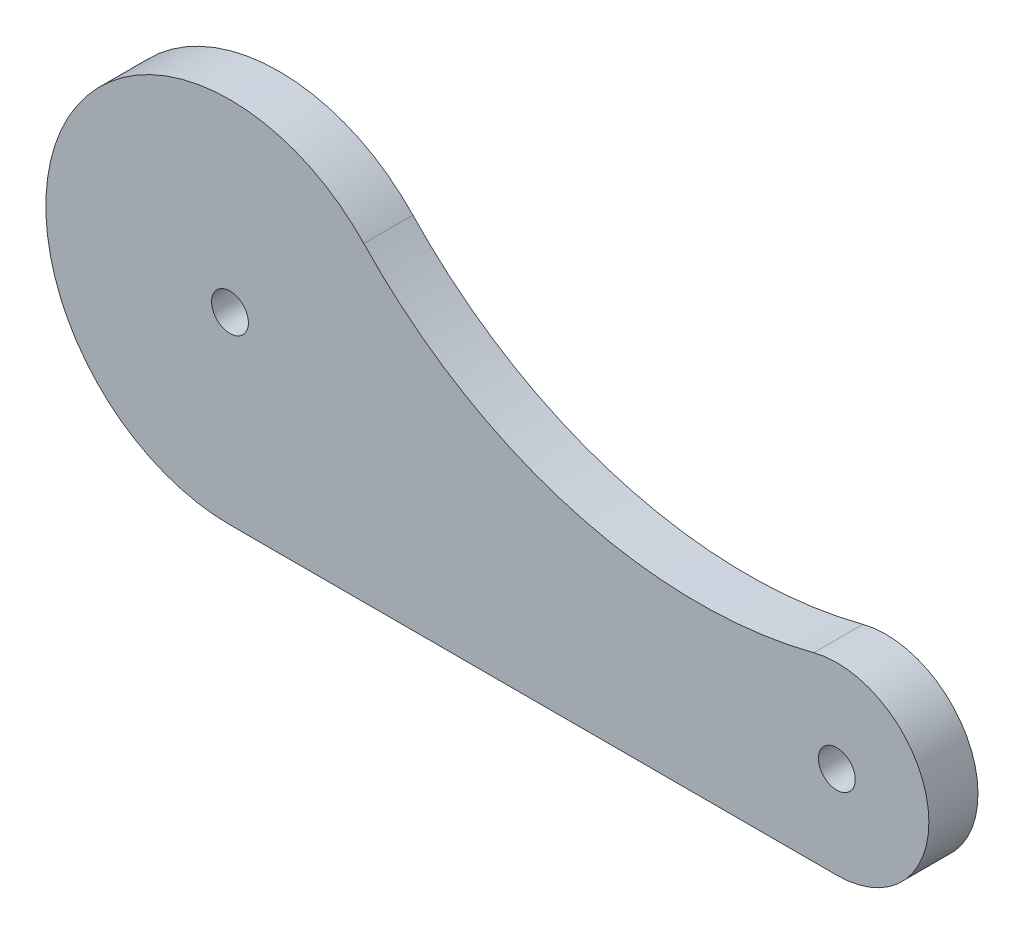
ISO-10303-21;
HEADER;
FILE_DESCRIPTION(('STEP AP214'),'2;1');
FILE_NAME('part.step','',(''),(''),'','','');
FILE_SCHEMA(('AUTOMOTIVE_DESIGN { 1 0 10303 214 1 1 1 1 }'));
ENDSEC;
DATA;
#1=APPLICATION_CONTEXT('core data for automotive mechanical design processes');
#2=APPLICATION_PROTOCOL_DEFINITION('international standard','automotive_design',2000,#1);
#3=PRODUCT_CONTEXT('',#1,'mechanical');
#4=PRODUCT('Part','Part','',(#3));
#5=PRODUCT_RELATED_PRODUCT_CATEGORY('part','',(#4));
#6=PRODUCT_DEFINITION_FORMATION('','',#4);
#7=PRODUCT_DEFINITION_CONTEXT('part definition',#1,'design');
#8=PRODUCT_DEFINITION('design','',#6,#7);
#9=PRODUCT_DEFINITION_SHAPE('','',#8);
#10=(LENGTH_UNIT() NAMED_UNIT(*) SI_UNIT(.MILLI.,.METRE.));
#11=(NAMED_UNIT(*) PLANE_ANGLE_UNIT() SI_UNIT($,.RADIAN.));
#12=(NAMED_UNIT(*) SI_UNIT($,.STERADIAN.) SOLID_ANGLE_UNIT());
#13=UNCERTAINTY_MEASURE_WITH_UNIT(LENGTH_MEASURE(1.E-05),#10,'distance_accuracy_value','');
#14=(GEOMETRIC_REPRESENTATION_CONTEXT(3) GLOBAL_UNCERTAINTY_ASSIGNED_CONTEXT((#13)) GLOBAL_UNIT_ASSIGNED_CONTEXT((#10,
#11,#12)) REPRESENTATION_CONTEXT('',''));
#15=CARTESIAN_POINT('',(0.,0.,0.));
#16=DIRECTION('',(0.,0.,1.));
#17=DIRECTION('',(1.,0.,0.));
#18=AXIS2_PLACEMENT_3D('',#15,#16,#17);
#19=CARTESIAN_POINT('',(0.,0.,4.));
#20=DIRECTION('',(0.,0.,1.));
#21=DIRECTION('',(1.,0.,0.));
#22=AXIS2_PLACEMENT_3D('',#19,#20,#21);
#23=PLANE('',#22);
#24=CARTESIAN_POINT('',(0.,0.,4.));
#25=DIRECTION('',(0.,0.,1.));
#26=DIRECTION('',(1.,0.,0.));
#27=AXIS2_PLACEMENT_3D('',#24,#25,#26);
#28=CIRCLE('',#27,1.5);
#29=CARTESIAN_POINT('',(1.5,0.,4.));
#30=VERTEX_POINT('',#29);
#31=EDGE_CURVE('E99',#30,#30,#28,.T.);
#32=ORIENTED_EDGE('',*,*,#31,.F.);
#33=EDGE_LOOP('',(#32));
#34=FACE_BOUND('',#33,.T.);
#35=CARTESIAN_POINT('',(0.,0.,4.));
#36=DIRECTION('',(0.,0.,1.));
#37=DIRECTION('',(1.,0.,0.));
#38=AXIS2_PLACEMENT_3D('',#35,#36,#37);
#39=CIRCLE('',#38,15.);
#40=CARTESIAN_POINT('',(10.9010401896387,10.3037528495147,4.));
#41=VERTEX_POINT('',#40);
#42=CARTESIAN_POINT('',(0.,-15.,4.));
#43=VERTEX_POINT('',#42);
#44=EDGE_CURVE('E84',#41,#43,#39,.T.);
#45=ORIENTED_EDGE('',*,*,#44,.T.);
#46=DIRECTION('',(1.,0.,0.));
#47=VECTOR('',#46,1.);
#48=CARTESIAN_POINT('',(0.,-15.,4.));
#49=LINE('',#48,#47);
#50=CARTESIAN_POINT('',(49.434299833213,-15.,4.));
#51=VERTEX_POINT('',#50);
#52=EDGE_CURVE('E79',#43,#51,#49,.T.);
#53=ORIENTED_EDGE('',*,*,#52,.T.);
#54=CARTESIAN_POINT('',(49.434299833213,-7.5,4.));
#55=DIRECTION('',(0.,0.,1.));
#56=DIRECTION('',(1.,0.,0.));
#57=AXIS2_PLACEMENT_3D('',#54,#55,#56);
#58=CIRCLE('',#57,7.50000000000001);
#59=CARTESIAN_POINT('',(47.5541899716334,-0.239477504449751,4.));
#60=VERTEX_POINT('',#59);
#61=EDGE_CURVE('E82',#51,#60,#58,.T.);
#62=ORIENTED_EDGE('',*,*,#61,.T.);
#63=CARTESIAN_POINT('',(38.1536406637354,36.0631349733015,4.));
#64=DIRECTION('',(0.,0.,-1.));
#65=DIRECTION('',(1.,0.,0.));
#66=AXIS2_PLACEMENT_3D('',#63,#64,#65);
#67=CIRCLE('',#66,37.5);
#68=EDGE_CURVE('E49',#60,#41,#67,.T.);
#69=ORIENTED_EDGE('',*,*,#68,.T.);
#70=EDGE_LOOP('',(#45,#53,#62,#69));
#71=FACE_BOUND('',#70,.T.);
#72=CARTESIAN_POINT('',(49.434299833213,-7.5,4.));
#73=DIRECTION('',(0.,0.,1.));
#74=DIRECTION('',(1.,0.,0.));
#75=AXIS2_PLACEMENT_3D('',#72,#73,#74);
#76=CIRCLE('',#75,1.5);
#77=CARTESIAN_POINT('',(50.934299833213,-7.5,4.));
#78=VERTEX_POINT('',#77);
#79=EDGE_CURVE('E114',#78,#78,#76,.T.);
#80=ORIENTED_EDGE('',*,*,#79,.F.);
#81=EDGE_LOOP('',(#80));
#82=FACE_BOUND('',#81,.T.);
#83=ADVANCED_FACE('F32',(#34,#71,#82),#23,.T.);
#84=CARTESIAN_POINT('',(0.,0.,0.));
#85=DIRECTION('',(0.,0.,1.));
#86=DIRECTION('',(1.,0.,0.));
#87=AXIS2_PLACEMENT_3D('',#84,#85,#86);
#88=PLANE('',#87);
#89=CARTESIAN_POINT('',(0.,0.,0.));
#90=DIRECTION('',(0.,0.,1.));
#91=DIRECTION('',(1.,0.,0.));
#92=AXIS2_PLACEMENT_3D('',#89,#90,#91);
#93=CIRCLE('',#92,1.5);
#94=CARTESIAN_POINT('',(1.5,0.,0.));
#95=VERTEX_POINT('',#94);
#96=EDGE_CURVE('E111',#95,#95,#93,.T.);
#97=ORIENTED_EDGE('',*,*,#96,.T.);
#98=EDGE_LOOP('',(#97));
#99=FACE_BOUND('',#98,.T.);
#100=CARTESIAN_POINT('',(0.,0.,0.));
#101=DIRECTION('',(0.,0.,1.));
#102=DIRECTION('',(1.,0.,0.));
#103=AXIS2_PLACEMENT_3D('',#100,#101,#102);
#104=CIRCLE('',#103,15.);
#105=CARTESIAN_POINT('',(10.9010401896387,10.3037528495147,0.));
#106=VERTEX_POINT('',#105);
#107=CARTESIAN_POINT('',(0.,-15.,0.));
#108=VERTEX_POINT('',#107);
#109=EDGE_CURVE('E96',#106,#108,#104,.T.);
#110=ORIENTED_EDGE('',*,*,#109,.F.);
#111=CARTESIAN_POINT('',(38.1536406637354,36.0631349733015,0.));
#112=DIRECTION('',(0.,0.,-1.));
#113=DIRECTION('',(1.,0.,0.));
#114=AXIS2_PLACEMENT_3D('',#111,#112,#113);
#115=CIRCLE('',#114,37.5);
#116=CARTESIAN_POINT('',(47.5541899716334,-0.239477504449751,0.));
#117=VERTEX_POINT('',#116);
#118=EDGE_CURVE('E72',#117,#106,#115,.T.);
#119=ORIENTED_EDGE('',*,*,#118,.F.);
#120=CARTESIAN_POINT('',(49.434299833213,-7.5,0.));
#121=DIRECTION('',(0.,0.,1.));
#122=DIRECTION('',(1.,0.,0.));
#123=AXIS2_PLACEMENT_3D('',#120,#121,#122);
#124=CIRCLE('',#123,7.50000000000001);
#125=CARTESIAN_POINT('',(49.434299833213,-15.,0.));
#126=VERTEX_POINT('',#125);
#127=EDGE_CURVE('E66',#126,#117,#124,.T.);
#128=ORIENTED_EDGE('',*,*,#127,.F.);
#129=DIRECTION('',(1.,0.,0.));
#130=VECTOR('',#129,1.);
#131=CARTESIAN_POINT('',(0.,-15.,0.));
#132=LINE('',#131,#130);
#133=EDGE_CURVE('E88',#108,#126,#132,.T.);
#134=ORIENTED_EDGE('',*,*,#133,.F.);
#135=EDGE_LOOP('',(#110,#119,#128,#134));
#136=FACE_BOUND('',#135,.T.);
#137=CARTESIAN_POINT('',(49.434299833213,-7.5,0.));
#138=DIRECTION('',(0.,0.,1.));
#139=DIRECTION('',(1.,0.,0.));
#140=AXIS2_PLACEMENT_3D('',#137,#138,#139);
#141=CIRCLE('',#140,1.5);
#142=CARTESIAN_POINT('',(50.934299833213,-7.5,0.));
#143=VERTEX_POINT('',#142);
#144=EDGE_CURVE('E117',#143,#143,#141,.T.);
#145=ORIENTED_EDGE('',*,*,#144,.T.);
#146=EDGE_LOOP('',(#145));
#147=FACE_BOUND('',#146,.T.);
#148=ADVANCED_FACE('F107',(#99,#136,#147),#88,.F.);
#149=CARTESIAN_POINT('',(0.,0.,4.));
#150=DIRECTION('',(0.,0.,-1.));
#151=DIRECTION('',(-1.,0.,0.));
#152=AXIS2_PLACEMENT_3D('',#149,#150,#151);
#153=CYLINDRICAL_SURFACE('',#152,15.);
#154=ORIENTED_EDGE('',*,*,#109,.T.);
#155=DIRECTION('',(0.,0.,-1.));
#156=VECTOR('',#155,1.);
#157=CARTESIAN_POINT('',(0.,-15.,4.));
#158=LINE('',#157,#156);
#159=EDGE_CURVE('E11',#43,#108,#158,.T.);
#160=ORIENTED_EDGE('',*,*,#159,.F.);
#161=ORIENTED_EDGE('',*,*,#44,.F.);
#162=DIRECTION('',(0.,0.,-1.));
#163=VECTOR('',#162,1.);
#164=CARTESIAN_POINT('',(10.9010401896387,10.3037528495147,4.));
#165=LINE('',#164,#163);
#166=EDGE_CURVE('E92',#41,#106,#165,.T.);
#167=ORIENTED_EDGE('',*,*,#166,.T.);
#168=EDGE_LOOP('',(#154,#160,#161,#167));
#169=FACE_BOUND('',#168,.T.);
#170=ADVANCED_FACE('F34',(#169),#153,.T.);
#171=CARTESIAN_POINT('',(0.,-15.,4.));
#172=DIRECTION('',(0.,1.,0.));
#173=DIRECTION('',(0.,0.,1.));
#174=AXIS2_PLACEMENT_3D('',#171,#172,#173);
#175=PLANE('',#174);
#176=ORIENTED_EDGE('',*,*,#133,.T.);
#177=DIRECTION('',(0.,0.,-1.));
#178=VECTOR('',#177,1.);
#179=CARTESIAN_POINT('',(49.434299833213,-15.,4.));
#180=LINE('',#179,#178);
#181=EDGE_CURVE('E41',#51,#126,#180,.T.);
#182=ORIENTED_EDGE('',*,*,#181,.F.);
#183=ORIENTED_EDGE('',*,*,#52,.F.);
#184=ORIENTED_EDGE('',*,*,#159,.T.);
#185=EDGE_LOOP('',(#176,#182,#183,#184));
#186=FACE_BOUND('',#185,.T.);
#187=ADVANCED_FACE('F87',(#186),#175,.F.);
#188=CARTESIAN_POINT('',(49.434299833213,-7.5,4.));
#189=DIRECTION('',(0.,0.,-1.));
#190=DIRECTION('',(-1.,0.,0.));
#191=AXIS2_PLACEMENT_3D('',#188,#189,#190);
#192=CYLINDRICAL_SURFACE('',#191,7.50000000000001);
#193=ORIENTED_EDGE('',*,*,#127,.T.);
#194=DIRECTION('',(0.,0.,-1.));
#195=VECTOR('',#194,1.);
#196=CARTESIAN_POINT('',(47.5541899716334,-0.239477504449751,4.));
#197=LINE('',#196,#195);
#198=EDGE_CURVE('E89',#60,#117,#197,.T.);
#199=ORIENTED_EDGE('',*,*,#198,.F.);
#200=ORIENTED_EDGE('',*,*,#61,.F.);
#201=ORIENTED_EDGE('',*,*,#181,.T.);
#202=EDGE_LOOP('',(#193,#199,#200,#201));
#203=FACE_BOUND('',#202,.T.);
#204=ADVANCED_FACE('F90',(#203),#192,.T.);
#205=CARTESIAN_POINT('',(38.1536406637354,36.0631349733015,4.));
#206=DIRECTION('',(0.,0.,-1.));
#207=DIRECTION('',(-1.,0.,0.));
#208=AXIS2_PLACEMENT_3D('',#205,#206,#207);
#209=CYLINDRICAL_SURFACE('',#208,37.5);
#210=ORIENTED_EDGE('',*,*,#118,.T.);
#211=ORIENTED_EDGE('',*,*,#166,.F.);
#212=ORIENTED_EDGE('',*,*,#68,.F.);
#213=ORIENTED_EDGE('',*,*,#198,.T.);
#214=EDGE_LOOP('',(#210,#211,#212,#213));
#215=FACE_BOUND('',#214,.T.);
#216=ADVANCED_FACE('F104',(#215),#209,.F.);
#217=CARTESIAN_POINT('',(0.,0.,4.));
#218=DIRECTION('',(0.,0.,-1.));
#219=DIRECTION('',(-1.,0.,0.));
#220=AXIS2_PLACEMENT_3D('',#217,#218,#219);
#221=CYLINDRICAL_SURFACE('',#220,1.5);
#222=ORIENTED_EDGE('',*,*,#31,.T.);
#223=EDGE_LOOP('',(#222));
#224=FACE_BOUND('',#223,.T.);
#225=ORIENTED_EDGE('',*,*,#96,.F.);
#226=EDGE_LOOP('',(#225));
#227=FACE_BOUND('',#226,.T.);
#228=ADVANCED_FACE('F135',(#224,#227),#221,.F.);
#229=CARTESIAN_POINT('',(49.434299833213,-7.5,4.));
#230=DIRECTION('',(0.,0.,-1.));
#231=DIRECTION('',(-1.,0.,0.));
#232=AXIS2_PLACEMENT_3D('',#229,#230,#231);
#233=CYLINDRICAL_SURFACE('',#232,1.5);
#234=ORIENTED_EDGE('',*,*,#79,.T.);
#235=EDGE_LOOP('',(#234));
#236=FACE_BOUND('',#235,.T.);
#237=ORIENTED_EDGE('',*,*,#144,.F.);
#238=EDGE_LOOP('',(#237));
#239=FACE_BOUND('',#238,.T.);
#240=ADVANCED_FACE('F123',(#236,#239),#233,.F.);
#241=CLOSED_SHELL('',(#83,#148,#170,#187,#204,#216,#228,#240));
#242=MANIFOLD_SOLID_BREP('B2',#241);
#243=ADVANCED_BREP_SHAPE_REPRESENTATION('',(#18,#242),#14);
#244=SHAPE_DEFINITION_REPRESENTATION(#9,#243);
ENDSEC;
END-ISO-10303-21;
